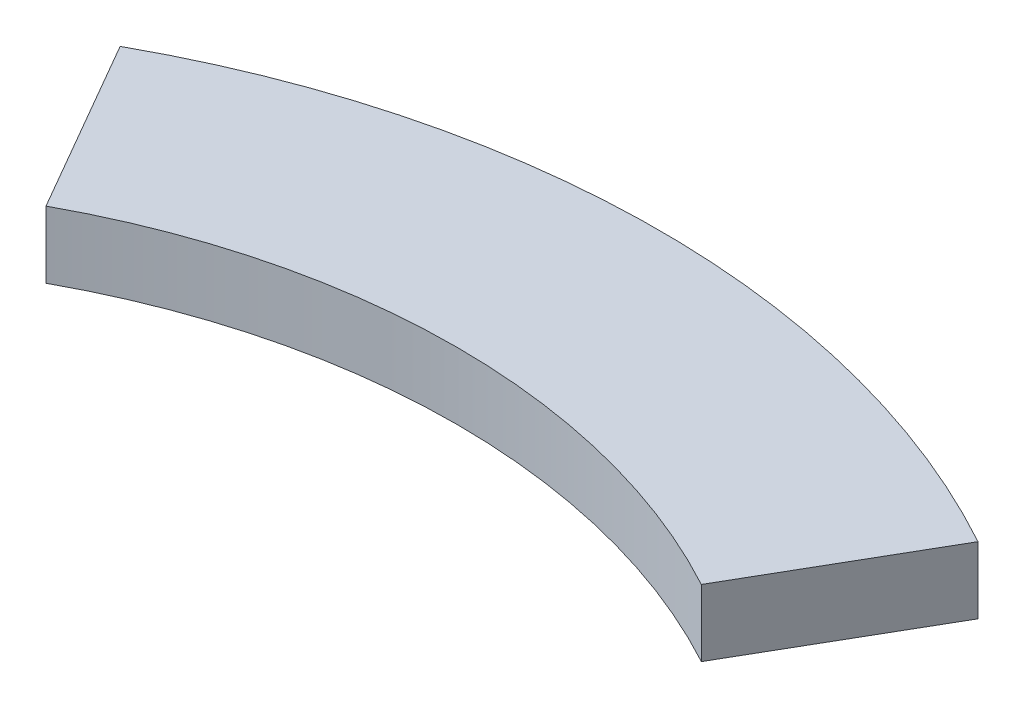
ISO-10303-21;
HEADER;
FILE_DESCRIPTION(('STEP AP214'),'2;1');
FILE_NAME('part.step','',(''),(''),'','','');
FILE_SCHEMA(('AUTOMOTIVE_DESIGN { 1 0 10303 214 1 1 1 1 }'));
ENDSEC;
DATA;
#1=APPLICATION_CONTEXT('core data for automotive mechanical design processes');
#2=APPLICATION_PROTOCOL_DEFINITION('international standard','automotive_design',2000,#1);
#3=PRODUCT_CONTEXT('',#1,'mechanical');
#4=PRODUCT('Part','Part','',(#3));
#5=PRODUCT_RELATED_PRODUCT_CATEGORY('part','',(#4));
#6=PRODUCT_DEFINITION_FORMATION('','',#4);
#7=PRODUCT_DEFINITION_CONTEXT('part definition',#1,'design');
#8=PRODUCT_DEFINITION('design','',#6,#7);
#9=PRODUCT_DEFINITION_SHAPE('','',#8);
#10=(LENGTH_UNIT() NAMED_UNIT(*) SI_UNIT(.MILLI.,.METRE.));
#11=(NAMED_UNIT(*) PLANE_ANGLE_UNIT() SI_UNIT($,.RADIAN.));
#12=(NAMED_UNIT(*) SI_UNIT($,.STERADIAN.) SOLID_ANGLE_UNIT());
#13=UNCERTAINTY_MEASURE_WITH_UNIT(LENGTH_MEASURE(1.E-05),#10,'distance_accuracy_value','');
#14=(GEOMETRIC_REPRESENTATION_CONTEXT(3) GLOBAL_UNCERTAINTY_ASSIGNED_CONTEXT((#13)) GLOBAL_UNIT_ASSIGNED_CONTEXT((#10,
#11,#12)) REPRESENTATION_CONTEXT('',''));
#15=CARTESIAN_POINT('',(0.,0.,0.));
#16=DIRECTION('',(0.,0.,1.));
#17=DIRECTION('',(1.,0.,0.));
#18=AXIS2_PLACEMENT_3D('',#15,#16,#17);
#19=CARTESIAN_POINT('',(0.,2.8,0.));
#20=DIRECTION('',(0.,-1.,0.));
#21=DIRECTION('',(0.,0.,-1.));
#22=AXIS2_PLACEMENT_3D('',#19,#20,#21);
#23=CYLINDRICAL_SURFACE('',#22,37.25);
#24=CARTESIAN_POINT('',(0.,0.,0.));
#25=DIRECTION('',(0.,1.,0.));
#26=DIRECTION('',(0.,0.,-1.));
#27=AXIS2_PLACEMENT_3D('',#24,#25,#26);
#28=CIRCLE('',#27,37.25);
#29=CARTESIAN_POINT('',(17.9717053966978,0.,-32.6279068457403));
#30=VERTEX_POINT('',#29);
#31=CARTESIAN_POINT('',(-17.9717053966979,0.,-32.6279068457402));
#32=VERTEX_POINT('',#31);
#33=EDGE_CURVE('E113',#30,#32,#28,.T.);
#34=ORIENTED_EDGE('',*,*,#33,.T.);
#35=DIRECTION('',(0.,-1.,0.));
#36=VECTOR('',#35,1.);
#37=CARTESIAN_POINT('',(-17.9717053966979,2.8,-32.6279068457402));
#38=LINE('',#37,#36);
#39=CARTESIAN_POINT('',(-17.9717053966979,2.8,-32.6279068457402));
#40=VERTEX_POINT('',#39);
#41=EDGE_CURVE('E11',#40,#32,#38,.T.);
#42=ORIENTED_EDGE('',*,*,#41,.F.);
#43=CARTESIAN_POINT('',(0.,2.8,0.));
#44=DIRECTION('',(0.,1.,0.));
#45=DIRECTION('',(0.,0.,-1.));
#46=AXIS2_PLACEMENT_3D('',#43,#44,#45);
#47=CIRCLE('',#46,37.25);
#48=CARTESIAN_POINT('',(17.9717053966978,2.8,-32.6279068457403));
#49=VERTEX_POINT('',#48);
#50=EDGE_CURVE('E97',#49,#40,#47,.T.);
#51=ORIENTED_EDGE('',*,*,#50,.F.);
#52=DIRECTION('',(0.,-1.,0.));
#53=VECTOR('',#52,1.);
#54=CARTESIAN_POINT('',(17.9717053966978,2.8,-32.6279068457403));
#55=LINE('',#54,#53);
#56=EDGE_CURVE('E109',#49,#30,#55,.T.);
#57=ORIENTED_EDGE('',*,*,#56,.T.);
#58=EDGE_LOOP('',(#34,#42,#51,#57));
#59=FACE_BOUND('',#58,.T.);
#60=ADVANCED_FACE('F45',(#59),#23,.T.);
#61=CARTESIAN_POINT('',(-17.9717053966979,2.8,-32.6279068457402));
#62=DIRECTION('',(0.866025403784436,0.,-0.500000000000004));
#63=DIRECTION('',(-0.500000000000004,0.,-0.866025403784436));
#64=AXIS2_PLACEMENT_3D('',#61,#62,#63);
#65=PLANE('',#64);
#66=DIRECTION('',(0.500000000000004,0.,0.866025403784436));
#67=VECTOR('',#66,1.);
#68=CARTESIAN_POINT('',(-17.9717053966979,0.,-32.6279068457402));
#69=LINE('',#68,#67);
#70=CARTESIAN_POINT('',(-13.7292564976257,0.,-25.2797698040326));
#71=VERTEX_POINT('',#70);
#72=EDGE_CURVE('E102',#32,#71,#69,.T.);
#73=ORIENTED_EDGE('',*,*,#72,.T.);
#74=DIRECTION('',(0.,-1.,0.));
#75=VECTOR('',#74,1.);
#76=CARTESIAN_POINT('',(-13.7292564976257,2.8,-25.2797698040326));
#77=LINE('',#76,#75);
#78=CARTESIAN_POINT('',(-13.7292564976257,2.8,-25.2797698040326));
#79=VERTEX_POINT('',#78);
#80=EDGE_CURVE('E54',#79,#71,#77,.T.);
#81=ORIENTED_EDGE('',*,*,#80,.F.);
#82=DIRECTION('',(0.500000000000004,0.,0.866025403784436));
#83=VECTOR('',#82,1.);
#84=CARTESIAN_POINT('',(-17.9717053966979,2.8,-32.6279068457402));
#85=LINE('',#84,#83);
#86=EDGE_CURVE('E92',#40,#79,#85,.T.);
#87=ORIENTED_EDGE('',*,*,#86,.F.);
#88=ORIENTED_EDGE('',*,*,#41,.T.);
#89=EDGE_LOOP('',(#73,#81,#87,#88));
#90=FACE_BOUND('',#89,.T.);
#91=ADVANCED_FACE('F101',(#90),#65,.F.);
#92=CARTESIAN_POINT('',(0.,2.8,0.));
#93=DIRECTION('',(0.,-1.,0.));
#94=DIRECTION('',(0.,0.,-1.));
#95=AXIS2_PLACEMENT_3D('',#92,#93,#94);
#96=CYLINDRICAL_SURFACE('',#95,28.7673294784635);
#97=CARTESIAN_POINT('',(0.,0.,0.));
#98=DIRECTION('',(0.,-1.,0.));
#99=DIRECTION('',(0.,0.,-1.));
#100=AXIS2_PLACEMENT_3D('',#97,#98,#99);
#101=CIRCLE('',#100,28.7673294784635);
#102=CARTESIAN_POINT('',(13.7292564976256,0.,-25.2797698040326));
#103=VERTEX_POINT('',#102);
#104=EDGE_CURVE('E79',#71,#103,#101,.T.);
#105=ORIENTED_EDGE('',*,*,#104,.T.);
#106=DIRECTION('',(0.,-1.,0.));
#107=VECTOR('',#106,1.);
#108=CARTESIAN_POINT('',(13.7292564976256,2.8,-25.2797698040326));
#109=LINE('',#108,#107);
#110=CARTESIAN_POINT('',(13.7292564976256,2.8,-25.2797698040326));
#111=VERTEX_POINT('',#110);
#112=EDGE_CURVE('E104',#111,#103,#109,.T.);
#113=ORIENTED_EDGE('',*,*,#112,.F.);
#114=CARTESIAN_POINT('',(0.,2.8,0.));
#115=DIRECTION('',(0.,-1.,0.));
#116=DIRECTION('',(0.,0.,-1.));
#117=AXIS2_PLACEMENT_3D('',#114,#115,#116);
#118=CIRCLE('',#117,28.7673294784635);
#119=EDGE_CURVE('E95',#79,#111,#118,.T.);
#120=ORIENTED_EDGE('',*,*,#119,.F.);
#121=ORIENTED_EDGE('',*,*,#80,.T.);
#122=EDGE_LOOP('',(#105,#113,#120,#121));
#123=FACE_BOUND('',#122,.T.);
#124=ADVANCED_FACE('F105',(#123),#96,.F.);
#125=CARTESIAN_POINT('',(17.9717053966978,2.8,-32.6279068457403));
#126=DIRECTION('',(-0.866025403784441,0.,-0.499999999999996));
#127=DIRECTION('',(-0.499999999999996,0.,0.866025403784441));
#128=AXIS2_PLACEMENT_3D('',#125,#126,#127);
#129=PLANE('',#128);
#130=DIRECTION('',(0.499999999999996,0.,-0.866025403784441));
#131=VECTOR('',#130,1.);
#132=CARTESIAN_POINT('',(17.9717053966978,0.,-32.6279068457403));
#133=LINE('',#132,#131);
#134=EDGE_CURVE('E85',#103,#30,#133,.T.);
#135=ORIENTED_EDGE('',*,*,#134,.T.);
#136=ORIENTED_EDGE('',*,*,#56,.F.);
#137=DIRECTION('',(0.499999999999996,0.,-0.866025403784441));
#138=VECTOR('',#137,1.);
#139=CARTESIAN_POINT('',(17.9717053966978,2.8,-32.6279068457403));
#140=LINE('',#139,#138);
#141=EDGE_CURVE('E62',#111,#49,#140,.T.);
#142=ORIENTED_EDGE('',*,*,#141,.F.);
#143=ORIENTED_EDGE('',*,*,#112,.T.);
#144=EDGE_LOOP('',(#135,#136,#142,#143));
#145=FACE_BOUND('',#144,.T.);
#146=ADVANCED_FACE('F127',(#145),#129,.F.);
#147=CARTESIAN_POINT('',(0.,2.8,0.));
#148=DIRECTION('',(0.,-1.,0.));
#149=DIRECTION('',(0.,0.,-1.));
#150=AXIS2_PLACEMENT_3D('',#147,#148,#149);
#151=PLANE('',#150);
#152=ORIENTED_EDGE('',*,*,#50,.T.);
#153=ORIENTED_EDGE('',*,*,#86,.T.);
#154=ORIENTED_EDGE('',*,*,#119,.T.);
#155=ORIENTED_EDGE('',*,*,#141,.T.);
#156=EDGE_LOOP('',(#152,#153,#154,#155));
#157=FACE_BOUND('',#156,.T.);
#158=ADVANCED_FACE('F93',(#157),#151,.F.);
#159=CARTESIAN_POINT('',(0.,0.,0.));
#160=DIRECTION('',(0.,-1.,0.));
#161=DIRECTION('',(0.,0.,-1.));
#162=AXIS2_PLACEMENT_3D('',#159,#160,#161);
#163=PLANE('',#162);
#164=CARTESIAN_POINT('',(0.,0.,-33.0086647392318));
#165=DIRECTION('',(0.,-1.,0.));
#166=DIRECTION('',(0.,0.,-1.));
#167=AXIS2_PLACEMENT_3D('',#164,#165,#166);
#168=CIRCLE('',#167,1.625);
#169=CARTESIAN_POINT('',(0.,0.,-34.6336647392318));
#170=VERTEX_POINT('',#169);
#171=EDGE_CURVE('E134',#170,#170,#168,.T.);
#172=ORIENTED_EDGE('',*,*,#171,.F.);
#173=EDGE_LOOP('',(#172));
#174=FACE_BOUND('',#173,.T.);
#175=ORIENTED_EDGE('',*,*,#33,.F.);
#176=ORIENTED_EDGE('',*,*,#134,.F.);
#177=ORIENTED_EDGE('',*,*,#104,.F.);
#178=ORIENTED_EDGE('',*,*,#72,.F.);
#179=EDGE_LOOP('',(#175,#176,#177,#178));
#180=FACE_BOUND('',#179,.T.);
#181=ADVANCED_FACE('F130',(#174,#180),#163,.T.);
#182=CARTESIAN_POINT('',(0.,2.,-33.0086647392318));
#183=DIRECTION('',(0.,-1.,0.));
#184=DIRECTION('',(0.,0.,-1.));
#185=AXIS2_PLACEMENT_3D('',#182,#183,#184);
#186=CYLINDRICAL_SURFACE('',#185,1.625);
#187=CARTESIAN_POINT('',(0.,2.,-33.0086647392318));
#188=DIRECTION('',(0.,-1.,0.));
#189=DIRECTION('',(0.,0.,-1.));
#190=AXIS2_PLACEMENT_3D('',#187,#188,#189);
#191=CIRCLE('',#190,1.625);
#192=CARTESIAN_POINT('',(0.,2.,-34.6336647392318));
#193=VERTEX_POINT('',#192);
#194=EDGE_CURVE('E117',#193,#193,#191,.T.);
#195=ORIENTED_EDGE('',*,*,#194,.F.);
#196=EDGE_LOOP('',(#195));
#197=FACE_BOUND('',#196,.T.);
#198=ORIENTED_EDGE('',*,*,#171,.T.);
#199=EDGE_LOOP('',(#198));
#200=FACE_BOUND('',#199,.T.);
#201=ADVANCED_FACE('F144',(#197,#200),#186,.F.);
#202=CARTESIAN_POINT('',(0.,2.,-33.0086647392318));
#203=DIRECTION('',(0.,-1.,0.));
#204=DIRECTION('',(0.,0.,-1.));
#205=AXIS2_PLACEMENT_3D('',#202,#203,#204);
#206=PLANE('',#205);
#207=ORIENTED_EDGE('',*,*,#194,.T.);
#208=EDGE_LOOP('',(#207));
#209=FACE_BOUND('',#208,.T.);
#210=ADVANCED_FACE('F142',(#209),#206,.T.);
#211=CLOSED_SHELL('',(#60,#91,#124,#146,#158,#181,#201,#210));
#212=MANIFOLD_SOLID_BREP('B2',#211);
#213=ADVANCED_BREP_SHAPE_REPRESENTATION('',(#18,#212),#14);
#214=SHAPE_DEFINITION_REPRESENTATION(#9,#213);
ENDSEC;
END-ISO-10303-21;
